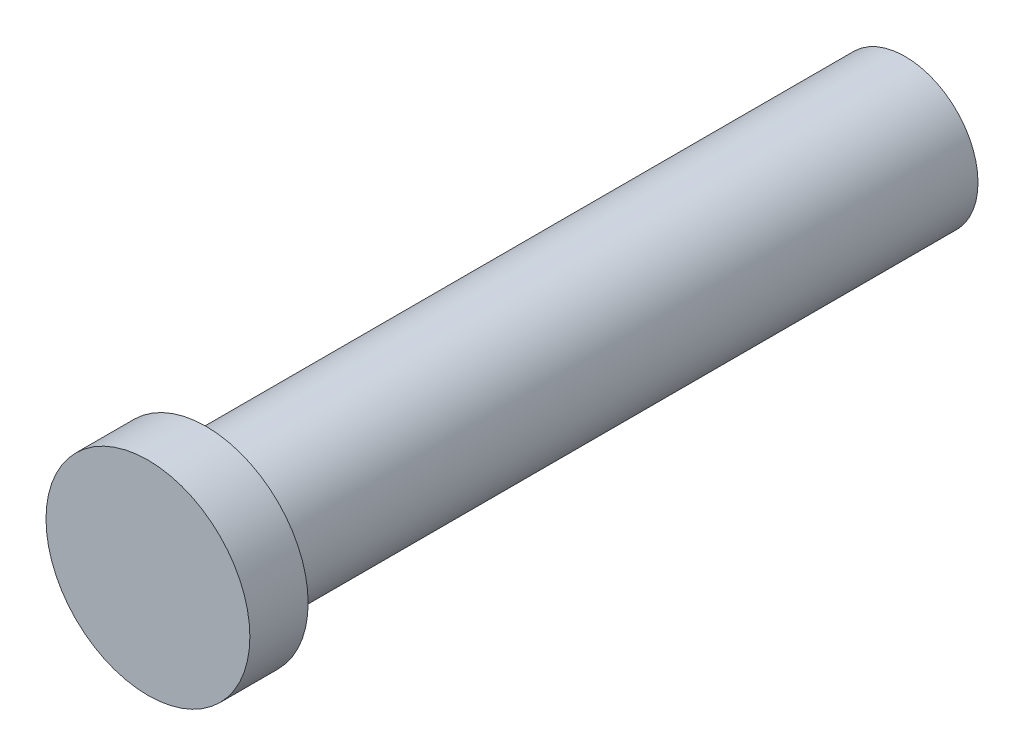
ISO-10303-21;
HEADER;
FILE_DESCRIPTION(('STEP AP214'),'2;1');
FILE_NAME('part.step','',(''),(''),'','','');
FILE_SCHEMA(('AUTOMOTIVE_DESIGN { 1 0 10303 214 1 1 1 1 }'));
ENDSEC;
DATA;
#1=APPLICATION_CONTEXT('core data for automotive mechanical design processes');
#2=APPLICATION_PROTOCOL_DEFINITION('international standard','automotive_design',2000,#1);
#3=PRODUCT_CONTEXT('',#1,'mechanical');
#4=PRODUCT('Part','Part','',(#3));
#5=PRODUCT_RELATED_PRODUCT_CATEGORY('part','',(#4));
#6=PRODUCT_DEFINITION_FORMATION('','',#4);
#7=PRODUCT_DEFINITION_CONTEXT('part definition',#1,'design');
#8=PRODUCT_DEFINITION('design','',#6,#7);
#9=PRODUCT_DEFINITION_SHAPE('','',#8);
#10=(LENGTH_UNIT() NAMED_UNIT(*) SI_UNIT(.MILLI.,.METRE.));
#11=(NAMED_UNIT(*) PLANE_ANGLE_UNIT() SI_UNIT($,.RADIAN.));
#12=(NAMED_UNIT(*) SI_UNIT($,.STERADIAN.) SOLID_ANGLE_UNIT());
#13=UNCERTAINTY_MEASURE_WITH_UNIT(LENGTH_MEASURE(1.E-05),#10,'distance_accuracy_value','');
#14=(GEOMETRIC_REPRESENTATION_CONTEXT(3) GLOBAL_UNCERTAINTY_ASSIGNED_CONTEXT((#13)) GLOBAL_UNIT_ASSIGNED_CONTEXT((#10,
#11,#12)) REPRESENTATION_CONTEXT('',''));
#15=CARTESIAN_POINT('',(0.,0.,0.));
#16=DIRECTION('',(0.,0.,1.));
#17=DIRECTION('',(1.,0.,0.));
#18=AXIS2_PLACEMENT_3D('',#15,#16,#17);
#19=CARTESIAN_POINT('',(0.,0.,12.));
#20=DIRECTION('',(0.,0.,-1.));
#21=DIRECTION('',(-1.,0.,0.));
#22=AXIS2_PLACEMENT_3D('',#19,#20,#21);
#23=CYLINDRICAL_SURFACE('',#22,1.25);
#24=CARTESIAN_POINT('',(0.,0.,12.));
#25=DIRECTION('',(0.,0.,1.));
#26=DIRECTION('',(1.,0.,0.));
#27=AXIS2_PLACEMENT_3D('',#24,#25,#26);
#28=CIRCLE('',#27,1.25);
#29=CARTESIAN_POINT('',(1.25,0.,12.));
#30=VERTEX_POINT('',#29);
#31=EDGE_CURVE('E10',#30,#30,#28,.T.);
#32=ORIENTED_EDGE('',*,*,#31,.F.);
#33=EDGE_LOOP('',(#32));
#34=FACE_BOUND('',#33,.T.);
#35=CARTESIAN_POINT('',(0.,0.,0.));
#36=DIRECTION('',(0.,0.,1.));
#37=DIRECTION('',(1.,0.,0.));
#38=AXIS2_PLACEMENT_3D('',#35,#36,#37);
#39=CIRCLE('',#38,1.25);
#40=CARTESIAN_POINT('',(1.25,0.,0.));
#41=VERTEX_POINT('',#40);
#42=EDGE_CURVE('E34',#41,#41,#39,.T.);
#43=ORIENTED_EDGE('',*,*,#42,.T.);
#44=EDGE_LOOP('',(#43));
#45=FACE_BOUND('',#44,.T.);
#46=ADVANCED_FACE('F31',(#34,#45),#23,.T.);
#47=CARTESIAN_POINT('',(0.,0.,0.));
#48=DIRECTION('',(0.,0.,1.));
#49=DIRECTION('',(1.,0.,0.));
#50=AXIS2_PLACEMENT_3D('',#47,#48,#49);
#51=PLANE('',#50);
#52=CARTESIAN_POINT('',(0.,0.,0.));
#53=DIRECTION('',(0.,0.,-1.));
#54=DIRECTION('',(-1.,0.,0.));
#55=AXIS2_PLACEMENT_3D('',#52,#53,#54);
#56=CIRCLE('',#55,0.75);
#57=CARTESIAN_POINT('',(-0.75,0.,0.));
#58=VERTEX_POINT('',#57);
#59=EDGE_CURVE('E49',#58,#58,#56,.T.);
#60=ORIENTED_EDGE('',*,*,#59,.F.);
#61=EDGE_LOOP('',(#60));
#62=FACE_BOUND('',#61,.T.);
#63=ORIENTED_EDGE('',*,*,#42,.F.);
#64=EDGE_LOOP('',(#63));
#65=FACE_BOUND('',#64,.T.);
#66=ADVANCED_FACE('F64',(#62,#65),#51,.F.);
#67=CARTESIAN_POINT('',(0.,0.,13.));
#68=DIRECTION('',(0.,0.,-1.));
#69=DIRECTION('',(-1.,0.,0.));
#70=AXIS2_PLACEMENT_3D('',#67,#68,#69);
#71=CYLINDRICAL_SURFACE('',#70,1.75);
#72=CARTESIAN_POINT('',(0.,0.,13.));
#73=DIRECTION('',(0.,0.,1.));
#74=DIRECTION('',(1.,0.,0.));
#75=AXIS2_PLACEMENT_3D('',#72,#73,#74);
#76=CIRCLE('',#75,1.75);
#77=CARTESIAN_POINT('',(1.75,0.,13.));
#78=VERTEX_POINT('',#77);
#79=EDGE_CURVE('E41',#78,#78,#76,.T.);
#80=ORIENTED_EDGE('',*,*,#79,.F.);
#81=EDGE_LOOP('',(#80));
#82=FACE_BOUND('',#81,.T.);
#83=CARTESIAN_POINT('',(0.,0.,12.));
#84=DIRECTION('',(0.,0.,1.));
#85=DIRECTION('',(1.,0.,0.));
#86=AXIS2_PLACEMENT_3D('',#83,#84,#85);
#87=CIRCLE('',#86,1.75);
#88=CARTESIAN_POINT('',(1.75,0.,12.));
#89=VERTEX_POINT('',#88);
#90=EDGE_CURVE('E43',#89,#89,#87,.T.);
#91=ORIENTED_EDGE('',*,*,#90,.T.);
#92=EDGE_LOOP('',(#91));
#93=FACE_BOUND('',#92,.T.);
#94=ADVANCED_FACE('F67',(#82,#93),#71,.T.);
#95=CARTESIAN_POINT('',(0.,0.,13.));
#96=DIRECTION('',(0.,0.,1.));
#97=DIRECTION('',(1.,0.,0.));
#98=AXIS2_PLACEMENT_3D('',#95,#96,#97);
#99=PLANE('',#98);
#100=ORIENTED_EDGE('',*,*,#79,.T.);
#101=EDGE_LOOP('',(#100));
#102=FACE_BOUND('',#101,.T.);
#103=ADVANCED_FACE('F86',(#102),#99,.T.);
#104=CARTESIAN_POINT('',(0.,0.,12.));
#105=DIRECTION('',(0.,0.,1.));
#106=DIRECTION('',(1.,0.,0.));
#107=AXIS2_PLACEMENT_3D('',#104,#105,#106);
#108=PLANE('',#107);
#109=ORIENTED_EDGE('',*,*,#31,.T.);
#110=EDGE_LOOP('',(#109));
#111=FACE_BOUND('',#110,.T.);
#112=ORIENTED_EDGE('',*,*,#90,.F.);
#113=EDGE_LOOP('',(#112));
#114=FACE_BOUND('',#113,.T.);
#115=ADVANCED_FACE('F60',(#111,#114),#108,.F.);
#116=CARTESIAN_POINT('',(0.,0.,3.));
#117=DIRECTION('',(0.,0.,-1.));
#118=DIRECTION('',(-1.,0.,0.));
#119=AXIS2_PLACEMENT_3D('',#116,#117,#118);
#120=CYLINDRICAL_SURFACE('',#119,0.75);
#121=CARTESIAN_POINT('',(0.,0.,3.));
#122=DIRECTION('',(0.,0.,-1.));
#123=DIRECTION('',(-1.,0.,0.));
#124=AXIS2_PLACEMENT_3D('',#121,#122,#123);
#125=CIRCLE('',#124,0.75);
#126=CARTESIAN_POINT('',(-0.75,0.,3.));
#127=VERTEX_POINT('',#126);
#128=EDGE_CURVE('E46',#127,#127,#125,.T.);
#129=ORIENTED_EDGE('',*,*,#128,.F.);
#130=EDGE_LOOP('',(#129));
#131=FACE_BOUND('',#130,.T.);
#132=ORIENTED_EDGE('',*,*,#59,.T.);
#133=EDGE_LOOP('',(#132));
#134=FACE_BOUND('',#133,.T.);
#135=ADVANCED_FACE('F57',(#131,#134),#120,.F.);
#136=CARTESIAN_POINT('',(0.,0.,3.));
#137=DIRECTION('',(0.,0.,-1.));
#138=DIRECTION('',(-1.,0.,0.));
#139=AXIS2_PLACEMENT_3D('',#136,#137,#138);
#140=PLANE('',#139);
#141=ORIENTED_EDGE('',*,*,#128,.T.);
#142=EDGE_LOOP('',(#141));
#143=FACE_BOUND('',#142,.T.);
#144=ADVANCED_FACE('F55',(#143),#140,.T.);
#145=CLOSED_SHELL('',(#46,#66,#94,#103,#115,#135,#144));
#146=MANIFOLD_SOLID_BREP('B2',#145);
#147=ADVANCED_BREP_SHAPE_REPRESENTATION('',(#18,#146),#14);
#148=SHAPE_DEFINITION_REPRESENTATION(#9,#147);
ENDSEC;
END-ISO-10303-21;
